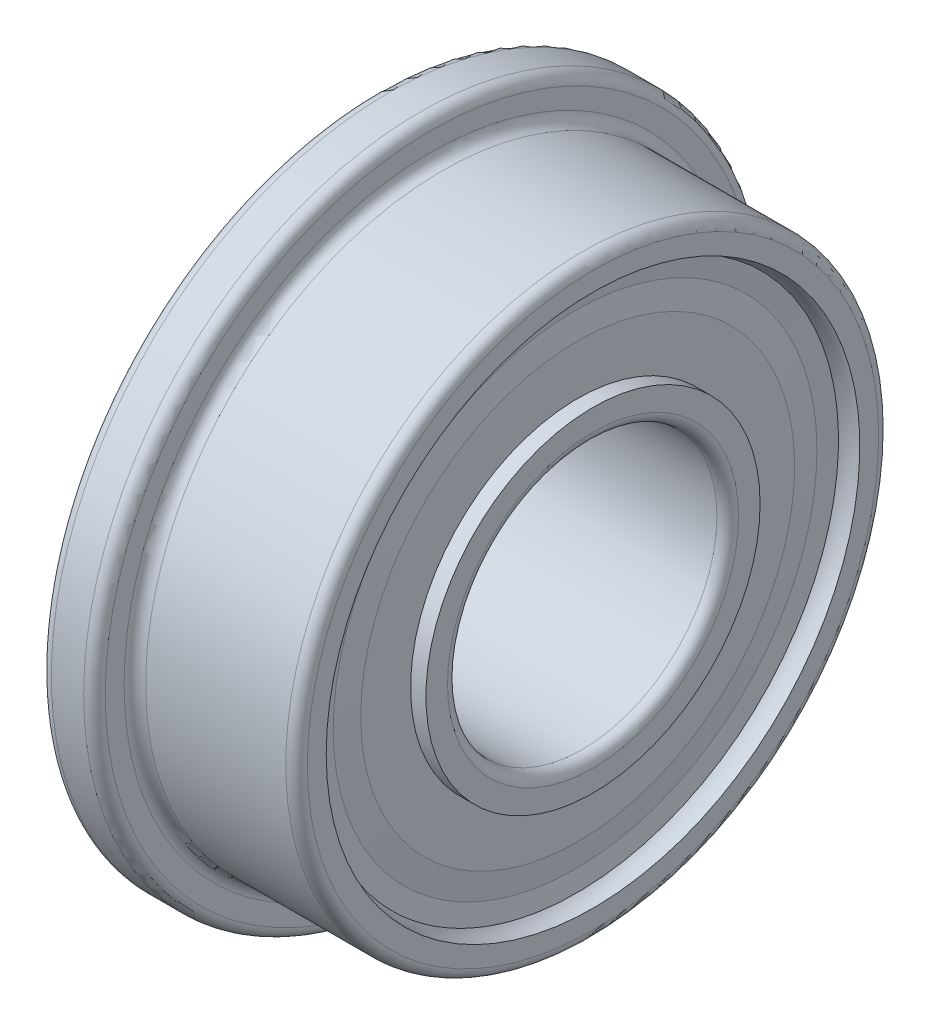
ISO-10303-21;
HEADER;
FILE_DESCRIPTION(('STEP AP214'),'2;1');
FILE_NAME('part.step','',(''),(''),'','','');
FILE_SCHEMA(('AUTOMOTIVE_DESIGN { 1 0 10303 214 1 1 1 1 }'));
ENDSEC;
DATA;
#1=APPLICATION_CONTEXT('core data for automotive mechanical design processes');
#2=APPLICATION_PROTOCOL_DEFINITION('international standard','automotive_design',2000,#1);
#3=PRODUCT_CONTEXT('',#1,'mechanical');
#4=PRODUCT('Part','Part','',(#3));
#5=PRODUCT_RELATED_PRODUCT_CATEGORY('part','',(#4));
#6=PRODUCT_DEFINITION_FORMATION('','',#4);
#7=PRODUCT_DEFINITION_CONTEXT('part definition',#1,'design');
#8=PRODUCT_DEFINITION('design','',#6,#7);
#9=PRODUCT_DEFINITION_SHAPE('','',#8);
#10=(LENGTH_UNIT() NAMED_UNIT(*) SI_UNIT(.MILLI.,.METRE.));
#11=(NAMED_UNIT(*) PLANE_ANGLE_UNIT() SI_UNIT($,.RADIAN.));
#12=(NAMED_UNIT(*) SI_UNIT($,.STERADIAN.) SOLID_ANGLE_UNIT());
#13=UNCERTAINTY_MEASURE_WITH_UNIT(LENGTH_MEASURE(1.E-05),#10,'distance_accuracy_value','');
#14=(GEOMETRIC_REPRESENTATION_CONTEXT(3) GLOBAL_UNCERTAINTY_ASSIGNED_CONTEXT((#13)) GLOBAL_UNIT_ASSIGNED_CONTEXT((#10,
#11,#12)) REPRESENTATION_CONTEXT('',''));
#15=CARTESIAN_POINT('',(0.,0.,0.));
#16=DIRECTION('',(0.,0.,1.));
#17=DIRECTION('',(1.,0.,0.));
#18=AXIS2_PLACEMENT_3D('',#15,#16,#17);
#19=CARTESIAN_POINT('',(2.,3.06417777247591,-2.57115043874616));
#20=DIRECTION('',(1.,0.,0.));
#21=DIRECTION('',(0.,0.766044443118978,-0.642787609686539));
#22=AXIS2_PLACEMENT_3D('',#19,#20,#21);
#23=SPHERICAL_SURFACE('',#22,0.794);
#24=CARTESIAN_POINT('',(2.794,3.06417777247591,-2.57115043874616));
#25=VERTEX_POINT('',#24);
#26=VERTEX_LOOP('',#25);
#27=FACE_BOUND('',#26,.T.);
#28=CARTESIAN_POINT('',(1.206,3.06417777247591,-2.57115043874616));
#29=VERTEX_POINT('',#28);
#30=VERTEX_LOOP('',#29);
#31=FACE_BOUND('',#30,.T.);
#32=ADVANCED_FACE('P0_F15',(#27,#31),#23,.T.);
#33=CLOSED_SHELL('',(#32));
#34=MANIFOLD_SOLID_BREP('P0_B1',#33);
#35=CARTESIAN_POINT('',(2.,-2.,3.46410161513775));
#36=DIRECTION('',(1.,0.,0.));
#37=DIRECTION('',(0.,-0.5,0.866025403784438));
#38=AXIS2_PLACEMENT_3D('',#35,#36,#37);
#39=SPHERICAL_SURFACE('',#38,0.794);
#40=CARTESIAN_POINT('',(2.794,-2.,3.46410161513775));
#41=VERTEX_POINT('',#40);
#42=VERTEX_LOOP('',#41);
#43=FACE_BOUND('',#42,.T.);
#44=CARTESIAN_POINT('',(1.206,-2.,3.46410161513775));
#45=VERTEX_POINT('',#44);
#46=VERTEX_LOOP('',#45);
#47=FACE_BOUND('',#46,.T.);
#48=ADVANCED_FACE('P1_F15',(#43,#47),#39,.T.);
#49=CLOSED_SHELL('',(#48));
#50=MANIFOLD_SOLID_BREP('P1_B1',#49);
#51=CARTESIAN_POINT('',(2.,0.,0.));
#52=DIRECTION('',(-1.,0.,0.));
#53=DIRECTION('',(0.,0.,1.));
#54=AXIS2_PLACEMENT_3D('',#51,#52,#53);
#55=TOROIDAL_SURFACE('',#54,4.,0.794);
#56=CARTESIAN_POINT('',(1.47996538576745,0.,0.));
#57=DIRECTION('',(1.,0.,0.));
#58=DIRECTION('',(0.,0.,-1.));
#59=AXIS2_PLACEMENT_3D('',#56,#57,#58);
#60=CIRCLE('',#59,3.4);
#61=CARTESIAN_POINT('',(1.47996538576745,0.,-3.4));
#62=VERTEX_POINT('',#61);
#63=EDGE_CURVE('P2_E200',#62,#62,#60,.F.);
#64=ORIENTED_EDGE('',*,*,#63,.F.);
#65=EDGE_LOOP('',(#64));
#66=FACE_BOUND('',#65,.T.);
#67=CARTESIAN_POINT('',(2.52003461423255,0.,0.));
#68=DIRECTION('',(1.,0.,0.));
#69=DIRECTION('',(0.,0.,-1.));
#70=AXIS2_PLACEMENT_3D('',#67,#68,#69);
#71=CIRCLE('',#70,3.4);
#72=CARTESIAN_POINT('',(2.52003461423255,0.,-3.4));
#73=VERTEX_POINT('',#72);
#74=EDGE_CURVE('P2_E195',#73,#73,#71,.T.);
#75=ORIENTED_EDGE('',*,*,#74,.F.);
#76=EDGE_LOOP('',(#75));
#77=FACE_BOUND('',#76,.T.);
#78=ADVANCED_FACE('P2_F16',(#66,#77),#55,.F.);
#79=CARTESIAN_POINT('',(0.773482692883724,0.,0.));
#80=DIRECTION('',(1.,0.,0.));
#81=DIRECTION('',(0.,0.,-1.));
#82=AXIS2_PLACEMENT_3D('',#79,#80,#81);
#83=CYLINDRICAL_SURFACE('',#82,3.4);
#84=CARTESIAN_POINT('',(0.647109888428069,0.,0.));
#85=DIRECTION('',(-1.,0.,0.));
#86=DIRECTION('',(0.,0.,1.));
#87=AXIS2_PLACEMENT_3D('',#84,#85,#86);
#88=CIRCLE('',#87,3.4);
#89=CARTESIAN_POINT('',(0.647109888428069,0.,3.4));
#90=VERTEX_POINT('',#89);
#91=EDGE_CURVE('P2_E193',#90,#90,#88,.F.);
#92=ORIENTED_EDGE('',*,*,#91,.T.);
#93=EDGE_LOOP('',(#92));
#94=FACE_BOUND('',#93,.T.);
#95=ORIENTED_EDGE('',*,*,#63,.T.);
#96=EDGE_LOOP('',(#95));
#97=FACE_BOUND('',#96,.T.);
#98=ADVANCED_FACE('P2_F277',(#94,#97),#83,.T.);
#99=CARTESIAN_POINT('',(3.22651730711628,0.,0.));
#100=DIRECTION('',(1.,0.,0.));
#101=DIRECTION('',(0.,0.,-1.));
#102=AXIS2_PLACEMENT_3D('',#99,#100,#101);
#103=CYLINDRICAL_SURFACE('',#102,3.4);
#104=CARTESIAN_POINT('',(3.35289011157193,0.,0.));
#105=DIRECTION('',(-1.,0.,0.));
#106=DIRECTION('',(0.,0.,1.));
#107=AXIS2_PLACEMENT_3D('',#104,#105,#106);
#108=CIRCLE('',#107,3.4);
#109=CARTESIAN_POINT('',(3.35289011157193,0.,3.4));
#110=VERTEX_POINT('',#109);
#111=EDGE_CURVE('P2_E190',#110,#110,#108,.T.);
#112=ORIENTED_EDGE('',*,*,#111,.T.);
#113=EDGE_LOOP('',(#112));
#114=FACE_BOUND('',#113,.T.);
#115=ORIENTED_EDGE('',*,*,#74,.T.);
#116=EDGE_LOOP('',(#115));
#117=FACE_BOUND('',#116,.T.);
#118=ADVANCED_FACE('P2_F270',(#114,#117),#103,.T.);
#119=CARTESIAN_POINT('',(0.324,0.,0.));
#120=DIRECTION('',(-1.,0.,0.));
#121=DIRECTION('',(0.,0.,1.));
#122=AXIS2_PLACEMENT_3D('',#119,#120,#121);
#123=TOROIDAL_SURFACE('',#122,3.424,0.323999999999999);
#124=ORIENTED_EDGE('',*,*,#91,.F.);
#125=EDGE_LOOP('',(#124));
#126=FACE_BOUND('',#125,.T.);
#127=CARTESIAN_POINT('',(0.324,0.,0.));
#128=DIRECTION('',(1.,0.,0.));
#129=DIRECTION('',(0.,0.,-1.));
#130=AXIS2_PLACEMENT_3D('',#127,#128,#129);
#131=CIRCLE('',#130,3.1);
#132=CARTESIAN_POINT('',(0.324,0.,-3.1));
#133=VERTEX_POINT('',#132);
#134=EDGE_CURVE('P2_E185',#133,#133,#131,.F.);
#135=ORIENTED_EDGE('',*,*,#134,.F.);
#136=EDGE_LOOP('',(#135));
#137=FACE_BOUND('',#136,.T.);
#138=ADVANCED_FACE('P2_F176',(#126,#137),#123,.F.);
#139=CARTESIAN_POINT('',(3.676,0.,0.));
#140=DIRECTION('',(-1.,0.,0.));
#141=DIRECTION('',(0.,0.,1.));
#142=AXIS2_PLACEMENT_3D('',#139,#140,#141);
#143=TOROIDAL_SURFACE('',#142,3.424,0.323999999999999);
#144=CARTESIAN_POINT('',(3.676,0.,0.));
#145=DIRECTION('',(1.,0.,0.));
#146=DIRECTION('',(0.,0.,-1.));
#147=AXIS2_PLACEMENT_3D('',#144,#145,#146);
#148=CIRCLE('',#147,3.1);
#149=CARTESIAN_POINT('',(3.676,0.,-3.1));
#150=VERTEX_POINT('',#149);
#151=EDGE_CURVE('P2_E182',#150,#150,#148,.T.);
#152=ORIENTED_EDGE('',*,*,#151,.F.);
#153=EDGE_LOOP('',(#152));
#154=FACE_BOUND('',#153,.T.);
#155=ORIENTED_EDGE('',*,*,#111,.F.);
#156=EDGE_LOOP('',(#155));
#157=FACE_BOUND('',#156,.T.);
#158=ADVANCED_FACE('P2_F172',(#154,#157),#143,.F.);
#159=CARTESIAN_POINT('',(0.162,0.,0.));
#160=DIRECTION('',(1.,0.,0.));
#161=DIRECTION('',(0.,0.,-1.));
#162=AXIS2_PLACEMENT_3D('',#159,#160,#161);
#163=CYLINDRICAL_SURFACE('',#162,3.1);
#164=CARTESIAN_POINT('',(0.,0.,0.));
#165=DIRECTION('',(1.,0.,0.));
#166=DIRECTION('',(0.,0.,-1.));
#167=AXIS2_PLACEMENT_3D('',#164,#165,#166);
#168=CIRCLE('',#167,3.1);
#169=CARTESIAN_POINT('',(0.,0.,-3.1));
#170=VERTEX_POINT('',#169);
#171=EDGE_CURVE('P2_E184',#170,#170,#168,.F.);
#172=ORIENTED_EDGE('',*,*,#171,.F.);
#173=EDGE_LOOP('',(#172));
#174=FACE_BOUND('',#173,.T.);
#175=ORIENTED_EDGE('',*,*,#134,.T.);
#176=EDGE_LOOP('',(#175));
#177=FACE_BOUND('',#176,.T.);
#178=ADVANCED_FACE('P2_F168',(#174,#177),#163,.T.);
#179=CARTESIAN_POINT('',(3.838,0.,0.));
#180=DIRECTION('',(1.,0.,0.));
#181=DIRECTION('',(0.,0.,-1.));
#182=AXIS2_PLACEMENT_3D('',#179,#180,#181);
#183=CYLINDRICAL_SURFACE('',#182,3.1);
#184=CARTESIAN_POINT('',(4.,0.,0.));
#185=DIRECTION('',(1.,0.,0.));
#186=DIRECTION('',(0.,0.,-1.));
#187=AXIS2_PLACEMENT_3D('',#184,#185,#186);
#188=CIRCLE('',#187,3.1);
#189=CARTESIAN_POINT('',(4.,0.,-3.1));
#190=VERTEX_POINT('',#189);
#191=EDGE_CURVE('P2_E64',#190,#190,#188,.T.);
#192=ORIENTED_EDGE('',*,*,#191,.F.);
#193=EDGE_LOOP('',(#192));
#194=FACE_BOUND('',#193,.T.);
#195=ORIENTED_EDGE('',*,*,#151,.T.);
#196=EDGE_LOOP('',(#195));
#197=FACE_BOUND('',#196,.T.);
#198=ADVANCED_FACE('P2_F156',(#194,#197),#183,.T.);
#199=CARTESIAN_POINT('',(0.,3.0165,0.));
#200=DIRECTION('',(-1.,0.,0.));
#201=DIRECTION('',(0.,-1.,0.));
#202=AXIS2_PLACEMENT_3D('',#199,#200,#201);
#203=PLANE('',#202);
#204=CARTESIAN_POINT('',(0.,0.,0.));
#205=DIRECTION('',(-1.,0.,0.));
#206=DIRECTION('',(0.,0.,1.));
#207=AXIS2_PLACEMENT_3D('',#204,#205,#206);
#208=CIRCLE('',#207,2.7);
#209=CARTESIAN_POINT('',(0.,0.,2.7));
#210=VERTEX_POINT('',#209);
#211=CARTESIAN_POINT('',(0.,2.7,0.));
#212=VERTEX_POINT('',#211);
#213=EDGE_CURVE('P2_E52',#210,#212,#208,.T.);
#214=ORIENTED_EDGE('',*,*,#213,.F.);
#215=CARTESIAN_POINT('',(0.,0.,0.));
#216=DIRECTION('',(-1.,0.,0.));
#217=DIRECTION('',(0.,0.,-1.));
#218=AXIS2_PLACEMENT_3D('',#215,#216,#217);
#219=CIRCLE('',#218,2.7);
#220=CARTESIAN_POINT('',(0.,0.,-2.7));
#221=VERTEX_POINT('',#220);
#222=EDGE_CURVE('P2_E60',#221,#210,#219,.T.);
#223=ORIENTED_EDGE('',*,*,#222,.F.);
#224=CARTESIAN_POINT('',(0.,0.,0.));
#225=DIRECTION('',(-1.,0.,0.));
#226=DIRECTION('',(0.,1.,0.));
#227=AXIS2_PLACEMENT_3D('',#224,#225,#226);
#228=CIRCLE('',#227,2.7);
#229=EDGE_CURVE('P2_E62',#212,#221,#228,.T.);
#230=ORIENTED_EDGE('',*,*,#229,.F.);
#231=EDGE_LOOP('',(#214,#223,#230));
#232=FACE_BOUND('',#231,.T.);
#233=ORIENTED_EDGE('',*,*,#171,.T.);
#234=EDGE_LOOP('',(#233));
#235=FACE_BOUND('',#234,.T.);
#236=ADVANCED_FACE('P2_F58',(#232,#235),#203,.T.);
#237=CARTESIAN_POINT('',(4.,3.0165,0.));
#238=DIRECTION('',(1.,0.,0.));
#239=DIRECTION('',(0.,1.,0.));
#240=AXIS2_PLACEMENT_3D('',#237,#238,#239);
#241=PLANE('',#240);
#242=CARTESIAN_POINT('',(4.,0.,0.));
#243=DIRECTION('',(1.,0.,0.));
#244=DIRECTION('',(0.,0.,1.));
#245=AXIS2_PLACEMENT_3D('',#242,#243,#244);
#246=CIRCLE('',#245,2.7);
#247=CARTESIAN_POINT('',(4.,0.,2.7));
#248=VERTEX_POINT('',#247);
#249=CARTESIAN_POINT('',(4.,0.,-2.7));
#250=VERTEX_POINT('',#249);
#251=EDGE_CURVE('P2_E69',#248,#250,#246,.T.);
#252=ORIENTED_EDGE('',*,*,#251,.F.);
#253=CARTESIAN_POINT('',(4.,0.,0.));
#254=DIRECTION('',(1.,0.,0.));
#255=DIRECTION('',(0.,1.,0.));
#256=AXIS2_PLACEMENT_3D('',#253,#254,#255);
#257=CIRCLE('',#256,2.7);
#258=CARTESIAN_POINT('',(4.,2.7,0.));
#259=VERTEX_POINT('',#258);
#260=EDGE_CURVE('P2_E121',#259,#248,#257,.T.);
#261=ORIENTED_EDGE('',*,*,#260,.F.);
#262=CARTESIAN_POINT('',(4.,0.,0.));
#263=DIRECTION('',(1.,0.,0.));
#264=DIRECTION('',(0.,0.,-1.));
#265=AXIS2_PLACEMENT_3D('',#262,#263,#264);
#266=CIRCLE('',#265,2.7);
#267=EDGE_CURVE('P2_E37',#250,#259,#266,.T.);
#268=ORIENTED_EDGE('',*,*,#267,.F.);
#269=EDGE_LOOP('',(#252,#261,#268));
#270=FACE_BOUND('',#269,.T.);
#271=ORIENTED_EDGE('',*,*,#191,.T.);
#272=EDGE_LOOP('',(#271));
#273=FACE_BOUND('',#272,.T.);
#274=ADVANCED_FACE('P2_F90',(#270,#273),#241,.T.);
#275=CARTESIAN_POINT('',(0.2,0.,0.));
#276=DIRECTION('',(-1.,0.,0.));
#277=DIRECTION('',(0.,0.,1.));
#278=AXIS2_PLACEMENT_3D('',#275,#276,#277);
#279=TOROIDAL_SURFACE('',#278,2.7,0.2);
#280=CARTESIAN_POINT('',(0.2,0.,0.));
#281=DIRECTION('',(1.,0.,0.));
#282=DIRECTION('',(0.,0.,-1.));
#283=AXIS2_PLACEMENT_3D('',#280,#281,#282);
#284=CIRCLE('',#283,2.5);
#285=CARTESIAN_POINT('',(0.2,0.,-2.5));
#286=VERTEX_POINT('',#285);
#287=EDGE_CURVE('P2_E28',#286,#286,#284,.T.);
#288=ORIENTED_EDGE('',*,*,#287,.T.);
#289=EDGE_LOOP('',(#288));
#290=FACE_BOUND('',#289,.T.);
#291=ORIENTED_EDGE('',*,*,#222,.T.);
#292=ORIENTED_EDGE('',*,*,#213,.T.);
#293=ORIENTED_EDGE('',*,*,#229,.T.);
#294=EDGE_LOOP('',(#291,#292,#293));
#295=FACE_BOUND('',#294,.T.);
#296=ADVANCED_FACE('P2_F68',(#290,#295),#279,.T.);
#297=CARTESIAN_POINT('',(3.8,0.,0.));
#298=DIRECTION('',(-1.,0.,0.));
#299=DIRECTION('',(0.,0.,1.));
#300=AXIS2_PLACEMENT_3D('',#297,#298,#299);
#301=TOROIDAL_SURFACE('',#300,2.7,0.2);
#302=CARTESIAN_POINT('',(3.8,0.,0.));
#303=DIRECTION('',(1.,0.,0.));
#304=DIRECTION('',(0.,0.,-1.));
#305=AXIS2_PLACEMENT_3D('',#302,#303,#304);
#306=CIRCLE('',#305,2.5);
#307=CARTESIAN_POINT('',(3.8,0.,-2.5));
#308=VERTEX_POINT('',#307);
#309=EDGE_CURVE('P2_E11',#308,#308,#306,.F.);
#310=ORIENTED_EDGE('',*,*,#309,.T.);
#311=EDGE_LOOP('',(#310));
#312=FACE_BOUND('',#311,.T.);
#313=ORIENTED_EDGE('',*,*,#267,.T.);
#314=ORIENTED_EDGE('',*,*,#260,.T.);
#315=ORIENTED_EDGE('',*,*,#251,.T.);
#316=EDGE_LOOP('',(#313,#314,#315));
#317=FACE_BOUND('',#316,.T.);
#318=ADVANCED_FACE('P2_F89',(#312,#317),#301,.T.);
#319=CARTESIAN_POINT('',(2.,0.,0.));
#320=DIRECTION('',(1.,0.,0.));
#321=DIRECTION('',(0.,0.,-1.));
#322=AXIS2_PLACEMENT_3D('',#319,#320,#321);
#323=CYLINDRICAL_SURFACE('',#322,2.5);
#324=ORIENTED_EDGE('',*,*,#309,.F.);
#325=EDGE_LOOP('',(#324));
#326=FACE_BOUND('',#325,.T.);
#327=ORIENTED_EDGE('',*,*,#287,.F.);
#328=EDGE_LOOP('',(#327));
#329=FACE_BOUND('',#328,.T.);
#330=ADVANCED_FACE('P2_F226',(#326,#329),#323,.F.);
#331=CLOSED_SHELL('',(#78,#98,#118,#138,#158,#178,#198,#236,#274,#296,#318,#330));
#332=MANIFOLD_SOLID_BREP('P2_B1',#331);
#333=CARTESIAN_POINT('',(2.,3.06417777247591,2.57115043874616));
#334=DIRECTION('',(1.,0.,0.));
#335=DIRECTION('',(0.,0.766044443118978,0.64278760968654));
#336=AXIS2_PLACEMENT_3D('',#333,#334,#335);
#337=SPHERICAL_SURFACE('',#336,0.794);
#338=CARTESIAN_POINT('',(2.794,3.06417777247591,2.57115043874616));
#339=VERTEX_POINT('',#338);
#340=VERTEX_LOOP('',#339);
#341=FACE_BOUND('',#340,.T.);
#342=CARTESIAN_POINT('',(1.206,3.06417777247591,2.57115043874616));
#343=VERTEX_POINT('',#342);
#344=VERTEX_LOOP('',#343);
#345=FACE_BOUND('',#344,.T.);
#346=ADVANCED_FACE('P3_F15',(#341,#345),#337,.T.);
#347=CLOSED_SHELL('',(#346));
#348=MANIFOLD_SOLID_BREP('P3_B1',#347);
#349=CARTESIAN_POINT('',(2.,-3.75877048314363,1.36808057330267));
#350=DIRECTION('',(1.,0.,0.));
#351=DIRECTION('',(0.,-0.939692620785908,0.342020143325669));
#352=AXIS2_PLACEMENT_3D('',#349,#350,#351);
#353=SPHERICAL_SURFACE('',#352,0.794);
#354=CARTESIAN_POINT('',(2.794,-3.75877048314363,1.36808057330267));
#355=VERTEX_POINT('',#354);
#356=VERTEX_LOOP('',#355);
#357=FACE_BOUND('',#356,.T.);
#358=CARTESIAN_POINT('',(1.206,-3.75877048314363,1.36808057330267));
#359=VERTEX_POINT('',#358);
#360=VERTEX_LOOP('',#359);
#361=FACE_BOUND('',#360,.T.);
#362=ADVANCED_FACE('P4_F15',(#357,#361),#353,.T.);
#363=CLOSED_SHELL('',(#362));
#364=MANIFOLD_SOLID_BREP('P4_B1',#363);
#365=CARTESIAN_POINT('',(2.,0.69459271066772,3.93923101204883));
#366=DIRECTION('',(1.,0.,0.));
#367=DIRECTION('',(0.,0.17364817766693,0.984807753012208));
#368=AXIS2_PLACEMENT_3D('',#365,#366,#367);
#369=SPHERICAL_SURFACE('',#368,0.794);
#370=CARTESIAN_POINT('',(2.794,0.69459271066772,3.93923101204883));
#371=VERTEX_POINT('',#370);
#372=VERTEX_LOOP('',#371);
#373=FACE_BOUND('',#372,.T.);
#374=CARTESIAN_POINT('',(1.206,0.69459271066772,3.93923101204883));
#375=VERTEX_POINT('',#374);
#376=VERTEX_LOOP('',#375);
#377=FACE_BOUND('',#376,.T.);
#378=ADVANCED_FACE('P5_F15',(#373,#377),#369,.T.);
#379=CLOSED_SHELL('',(#378));
#380=MANIFOLD_SOLID_BREP('P5_B1',#379);
#381=CARTESIAN_POINT('',(0.381500000003143,0.,0.));
#382=DIRECTION('',(-1.,0.,0.));
#383=DIRECTION('',(0.,0.,1.));
#384=AXIS2_PLACEMENT_3D('',#381,#382,#383);
#385=CONICAL_SURFACE('',#384,4.950000000008,1.37331599263898);
#386=CARTESIAN_POINT('',(0.3815,0.,0.));
#387=DIRECTION('',(1.,0.,0.));
#388=DIRECTION('',(0.,0.,-1.));
#389=AXIS2_PLACEMENT_3D('',#386,#387,#388);
#390=CIRCLE('',#389,4.95);
#391=CARTESIAN_POINT('',(0.3815,0.,-4.95));
#392=VERTEX_POINT('',#391);
#393=EDGE_CURVE('P6_E29',#392,#392,#390,.F.);
#394=ORIENTED_EDGE('',*,*,#393,.F.);
#395=EDGE_LOOP('',(#394));
#396=FACE_BOUND('',#395,.T.);
#397=CARTESIAN_POINT('',(0.477000000003613,0.,0.));
#398=DIRECTION('',(-1.,0.,0.));
#399=DIRECTION('',(0.,0.,1.));
#400=AXIS2_PLACEMENT_3D('',#397,#398,#399);
#401=CIRCLE('',#400,4.47271040542319);
#402=CARTESIAN_POINT('',(0.477000000003613,0.,4.47271040542319));
#403=VERTEX_POINT('',#402);
#404=EDGE_CURVE('P6_E17',#403,#403,#401,.F.);
#405=ORIENTED_EDGE('',*,*,#404,.F.);
#406=EDGE_LOOP('',(#405));
#407=FACE_BOUND('',#406,.T.);
#408=ADVANCED_FACE('P6_F14',(#396,#407),#385,.T.);
#409=CARTESIAN_POINT('',(0.477,4.2488552027027,0.));
#410=DIRECTION('',(1.,0.,0.));
#411=DIRECTION('',(0.,0.,-1.));
#412=AXIS2_PLACEMENT_3D('',#409,#410,#411);
#413=PLANE('',#412);
#414=CARTESIAN_POINT('',(0.477000000002377,0.,0.));
#415=DIRECTION('',(1.,0.,0.));
#416=DIRECTION('',(0.,0.,-1.));
#417=AXIS2_PLACEMENT_3D('',#414,#415,#416);
#418=CIRCLE('',#417,4.02500000001282);
#419=CARTESIAN_POINT('',(0.477000000002377,0.,-4.02500000001282));
#420=VERTEX_POINT('',#419);
#421=EDGE_CURVE('P6_E31',#420,#420,#418,.F.);
#422=ORIENTED_EDGE('',*,*,#421,.T.);
#423=EDGE_LOOP('',(#422));
#424=FACE_BOUND('',#423,.T.);
#425=ORIENTED_EDGE('',*,*,#404,.T.);
#426=EDGE_LOOP('',(#425));
#427=FACE_BOUND('',#426,.T.);
#428=ADVANCED_FACE('P6_F44',(#424,#427),#413,.T.);
#429=CARTESIAN_POINT('',(0.33375,0.,0.));
#430=DIRECTION('',(1.,0.,0.));
#431=DIRECTION('',(0.,0.,-1.));
#432=AXIS2_PLACEMENT_3D('',#429,#430,#431);
#433=CYLINDRICAL_SURFACE('',#432,4.95);
#434=CARTESIAN_POINT('',(0.286000000002673,0.,0.));
#435=DIRECTION('',(-1.,0.,0.));
#436=DIRECTION('',(0.,1.,0.));
#437=AXIS2_PLACEMENT_3D('',#434,#435,#436);
#438=CIRCLE('',#437,4.950000000008);
#439=CARTESIAN_POINT('',(0.286000000002673,4.950000000008,0.));
#440=VERTEX_POINT('',#439);
#441=EDGE_CURVE('P6_E33',#440,#440,#438,.F.);
#442=ORIENTED_EDGE('',*,*,#441,.T.);
#443=EDGE_LOOP('',(#442));
#444=FACE_BOUND('',#443,.T.);
#445=ORIENTED_EDGE('',*,*,#393,.T.);
#446=EDGE_LOOP('',(#445));
#447=FACE_BOUND('',#446,.T.);
#448=ADVANCED_FACE('P6_F52',(#444,#447),#433,.T.);
#449=CARTESIAN_POINT('',(0.476999999996508,0.,0.));
#450=DIRECTION('',(1.,0.,0.));
#451=DIRECTION('',(0.,0.,-1.));
#452=AXIS2_PLACEMENT_3D('',#449,#450,#451);
#453=CONICAL_SURFACE('',#452,4.02499999995598,1.4679175842122);
#454=ORIENTED_EDGE('',*,*,#421,.F.);
#455=EDGE_LOOP('',(#454));
#456=FACE_BOUND('',#455,.T.);
#457=CARTESIAN_POINT('',(0.3815,0.,0.));
#458=DIRECTION('',(1.,0.,0.));
#459=DIRECTION('',(0.,0.,-1.));
#460=AXIS2_PLACEMENT_3D('',#457,#458,#459);
#461=CIRCLE('',#460,3.1);
#462=CARTESIAN_POINT('',(0.3815,0.,-3.1));
#463=VERTEX_POINT('',#462);
#464=EDGE_CURVE('P6_E37',#463,#463,#461,.F.);
#465=ORIENTED_EDGE('',*,*,#464,.T.);
#466=EDGE_LOOP('',(#465));
#467=FACE_BOUND('',#466,.T.);
#468=ADVANCED_FACE('P6_F71',(#456,#467),#453,.F.);
#469=CARTESIAN_POINT('',(0.286000000009778,0.,0.));
#470=DIRECTION('',(-1.,0.,0.));
#471=DIRECTION('',(0.,0.,1.));
#472=AXIS2_PLACEMENT_3D('',#469,#470,#471);
#473=CONICAL_SURFACE('',#472,4.94999999995116,1.46791758421715);
#474=CARTESIAN_POINT('',(0.333749999995803,0.,0.));
#475=DIRECTION('',(1.,0.,0.));
#476=DIRECTION('',(0.,1.,0.));
#477=AXIS2_PLACEMENT_3D('',#474,#475,#476);
#478=CIRCLE('',#477,4.48749999998199);
#479=CARTESIAN_POINT('',(0.333749999995803,4.48749999998199,0.));
#480=VERTEX_POINT('',#479);
#481=EDGE_CURVE('P6_E26',#480,#480,#478,.F.);
#482=ORIENTED_EDGE('',*,*,#481,.F.);
#483=EDGE_LOOP('',(#482));
#484=FACE_BOUND('',#483,.T.);
#485=ORIENTED_EDGE('',*,*,#441,.F.);
#486=EDGE_LOOP('',(#485));
#487=FACE_BOUND('',#486,.T.);
#488=ADVANCED_FACE('P6_F67',(#484,#487),#473,.F.);
#489=CARTESIAN_POINT('',(0.33375,0.,0.));
#490=DIRECTION('',(1.,0.,0.));
#491=DIRECTION('',(0.,0.,-1.));
#492=AXIS2_PLACEMENT_3D('',#489,#490,#491);
#493=CYLINDRICAL_SURFACE('',#492,3.1);
#494=ORIENTED_EDGE('',*,*,#464,.F.);
#495=EDGE_LOOP('',(#494));
#496=FACE_BOUND('',#495,.T.);
#497=CARTESIAN_POINT('',(0.286,0.,0.));
#498=DIRECTION('',(1.,0.,0.));
#499=DIRECTION('',(0.,0.,-1.));
#500=AXIS2_PLACEMENT_3D('',#497,#498,#499);
#501=CIRCLE('',#500,3.1);
#502=CARTESIAN_POINT('',(0.286,0.,-3.1));
#503=VERTEX_POINT('',#502);
#504=EDGE_CURVE('P6_E21',#503,#503,#501,.T.);
#505=ORIENTED_EDGE('',*,*,#504,.F.);
#506=EDGE_LOOP('',(#505));
#507=FACE_BOUND('',#506,.T.);
#508=ADVANCED_FACE('P6_F60',(#496,#507),#493,.F.);
#509=CARTESIAN_POINT('',(0.333749999988697,0.,0.));
#510=DIRECTION('',(1.,0.,0.));
#511=DIRECTION('',(0.,0.,-1.));
#512=AXIS2_PLACEMENT_3D('',#509,#510,#511);
#513=CONICAL_SURFACE('',#512,4.48749999992515,1.4679175842046);
#514=CARTESIAN_POINT('',(0.285999999994331,0.,0.));
#515=DIRECTION('',(1.,0.,0.));
#516=DIRECTION('',(0.,0.,-1.));
#517=AXIS2_PLACEMENT_3D('',#514,#515,#516);
#518=CIRCLE('',#517,4.02500000001282);
#519=CARTESIAN_POINT('',(0.285999999994331,0.,-4.02500000001282));
#520=VERTEX_POINT('',#519);
#521=EDGE_CURVE('P6_E10',#520,#520,#518,.F.);
#522=ORIENTED_EDGE('',*,*,#521,.F.);
#523=EDGE_LOOP('',(#522));
#524=FACE_BOUND('',#523,.T.);
#525=ORIENTED_EDGE('',*,*,#481,.T.);
#526=EDGE_LOOP('',(#525));
#527=FACE_BOUND('',#526,.T.);
#528=ADVANCED_FACE('P6_F55',(#524,#527),#513,.T.);
#529=CARTESIAN_POINT('',(0.286,3.5625,0.));
#530=DIRECTION('',(-1.,0.,0.));
#531=DIRECTION('',(0.,0.,1.));
#532=AXIS2_PLACEMENT_3D('',#529,#530,#531);
#533=PLANE('',#532);
#534=ORIENTED_EDGE('',*,*,#521,.T.);
#535=EDGE_LOOP('',(#534));
#536=FACE_BOUND('',#535,.T.);
#537=ORIENTED_EDGE('',*,*,#504,.T.);
#538=EDGE_LOOP('',(#537));
#539=FACE_BOUND('',#538,.T.);
#540=ADVANCED_FACE('P6_F53',(#536,#539),#533,.T.);
#541=CLOSED_SHELL('',(#408,#428,#448,#468,#488,#508,#528,#540));
#542=MANIFOLD_SOLID_BREP('P6_B1',#541);
#543=CARTESIAN_POINT('',(2.,-3.75877048314363,-1.36808057330268));
#544=DIRECTION('',(1.,0.,0.));
#545=DIRECTION('',(0.,-0.939692620785908,-0.342020143325669));
#546=AXIS2_PLACEMENT_3D('',#543,#544,#545);
#547=SPHERICAL_SURFACE('',#546,0.794);
#548=CARTESIAN_POINT('',(2.794,-3.75877048314363,-1.36808057330268));
#549=VERTEX_POINT('',#548);
#550=VERTEX_LOOP('',#549);
#551=FACE_BOUND('',#550,.T.);
#552=CARTESIAN_POINT('',(1.206,-3.75877048314363,-1.36808057330268));
#553=VERTEX_POINT('',#552);
#554=VERTEX_LOOP('',#553);
#555=FACE_BOUND('',#554,.T.);
#556=ADVANCED_FACE('P7_F15',(#551,#555),#547,.T.);
#557=CLOSED_SHELL('',(#556));
#558=MANIFOLD_SOLID_BREP('P7_B1',#557);
#559=CARTESIAN_POINT('',(2.,0.694592710667722,-3.93923101204883));
#560=DIRECTION('',(1.,0.,0.));
#561=DIRECTION('',(0.,0.17364817766693,-0.984807753012208));
#562=AXIS2_PLACEMENT_3D('',#559,#560,#561);
#563=SPHERICAL_SURFACE('',#562,0.794);
#564=CARTESIAN_POINT('',(2.794,0.694592710667722,-3.93923101204883));
#565=VERTEX_POINT('',#564);
#566=VERTEX_LOOP('',#565);
#567=FACE_BOUND('',#566,.T.);
#568=CARTESIAN_POINT('',(1.206,0.694592710667722,-3.93923101204883));
#569=VERTEX_POINT('',#568);
#570=VERTEX_LOOP('',#569);
#571=FACE_BOUND('',#570,.T.);
#572=ADVANCED_FACE('P8_F15',(#567,#571),#563,.T.);
#573=CLOSED_SHELL('',(#572));
#574=MANIFOLD_SOLID_BREP('P8_B1',#573);
#575=CARTESIAN_POINT('',(3.61949999999922,0.,0.));
#576=DIRECTION('',(1.,0.,0.));
#577=DIRECTION('',(0.,0.,-1.));
#578=AXIS2_PLACEMENT_3D('',#575,#576,#577);
#579=CONICAL_SURFACE('',#578,4.94999999995116,1.37331599264469);
#580=CARTESIAN_POINT('',(3.52400000001296,0.,0.));
#581=DIRECTION('',(1.,0.,0.));
#582=DIRECTION('',(0.,0.,-1.));
#583=AXIS2_PLACEMENT_3D('',#580,#581,#582);
#584=CIRCLE('',#583,4.47271040542319);
#585=CARTESIAN_POINT('',(3.52400000001296,0.,-4.47271040542319));
#586=VERTEX_POINT('',#585);
#587=EDGE_CURVE('P9_E17',#586,#586,#584,.F.);
#588=ORIENTED_EDGE('',*,*,#587,.F.);
#589=EDGE_LOOP('',(#588));
#590=FACE_BOUND('',#589,.T.);
#591=CARTESIAN_POINT('',(3.6195,0.,0.));
#592=DIRECTION('',(1.,0.,0.));
#593=DIRECTION('',(0.,0.,-1.));
#594=AXIS2_PLACEMENT_3D('',#591,#592,#593);
#595=CIRCLE('',#594,4.95);
#596=CARTESIAN_POINT('',(3.6195,0.,-4.95));
#597=VERTEX_POINT('',#596);
#598=EDGE_CURVE('P9_E29',#597,#597,#595,.T.);
#599=ORIENTED_EDGE('',*,*,#598,.F.);
#600=EDGE_LOOP('',(#599));
#601=FACE_BOUND('',#600,.T.);
#602=ADVANCED_FACE('P9_F14',(#590,#601),#579,.T.);
#603=CARTESIAN_POINT('',(3.66725,0.,0.));
#604=DIRECTION('',(1.,0.,0.));
#605=DIRECTION('',(0.,0.,-1.));
#606=AXIS2_PLACEMENT_3D('',#603,#604,#605);
#607=CYLINDRICAL_SURFACE('',#606,4.95);
#608=ORIENTED_EDGE('',*,*,#598,.T.);
#609=EDGE_LOOP('',(#608));
#610=FACE_BOUND('',#609,.T.);
#611=CARTESIAN_POINT('',(3.71499999999969,0.,0.));
#612=DIRECTION('',(1.,0.,0.));
#613=DIRECTION('',(0.,1.,0.));
#614=AXIS2_PLACEMENT_3D('',#611,#612,#613);
#615=CIRCLE('',#614,4.950000000008);
#616=CARTESIAN_POINT('',(3.71499999999969,4.950000000008,0.));
#617=VERTEX_POINT('',#616);
#618=EDGE_CURVE('P9_E34',#617,#617,#615,.F.);
#619=ORIENTED_EDGE('',*,*,#618,.T.);
#620=EDGE_LOOP('',(#619));
#621=FACE_BOUND('',#620,.T.);
#622=ADVANCED_FACE('P9_F73',(#610,#621),#607,.T.);
#623=CARTESIAN_POINT('',(3.524,4.2488552027027,0.));
#624=DIRECTION('',(-1.,0.,0.));
#625=DIRECTION('',(0.,0.,1.));
#626=AXIS2_PLACEMENT_3D('',#623,#624,#625);
#627=PLANE('',#626);
#628=ORIENTED_EDGE('',*,*,#587,.T.);
#629=EDGE_LOOP('',(#628));
#630=FACE_BOUND('',#629,.T.);
#631=CARTESIAN_POINT('',(3.52399999999288,0.,0.));
#632=DIRECTION('',(-1.,0.,0.));
#633=DIRECTION('',(0.,0.,1.));
#634=AXIS2_PLACEMENT_3D('',#631,#632,#633);
#635=CIRCLE('',#634,4.02500000001282);
#636=CARTESIAN_POINT('',(3.52399999999288,0.,4.02500000001282));
#637=VERTEX_POINT('',#636);
#638=EDGE_CURVE('P9_E31',#637,#637,#635,.F.);
#639=ORIENTED_EDGE('',*,*,#638,.T.);
#640=EDGE_LOOP('',(#639));
#641=FACE_BOUND('',#640,.T.);
#642=ADVANCED_FACE('P9_F70',(#630,#641),#627,.T.);
#643=CARTESIAN_POINT('',(3.71499999999969,0.,0.));
#644=DIRECTION('',(1.,0.,0.));
#645=DIRECTION('',(0.,0.,-1.));
#646=AXIS2_PLACEMENT_3D('',#643,#644,#645);
#647=CONICAL_SURFACE('',#646,4.94999999995116,1.46791758420195);
#648=ORIENTED_EDGE('',*,*,#618,.F.);
#649=EDGE_LOOP('',(#648));
#650=FACE_BOUND('',#649,.T.);
#651=CARTESIAN_POINT('',(3.66725000000656,0.,0.));
#652=DIRECTION('',(-1.,0.,0.));
#653=DIRECTION('',(0.,1.,0.));
#654=AXIS2_PLACEMENT_3D('',#651,#652,#653);
#655=CIRCLE('',#654,4.48749999998199);
#656=CARTESIAN_POINT('',(3.66725000000656,4.48749999998199,0.));
#657=VERTEX_POINT('',#656);
#658=EDGE_CURVE('P9_E33',#657,#657,#655,.F.);
#659=ORIENTED_EDGE('',*,*,#658,.F.);
#660=EDGE_LOOP('',(#659));
#661=FACE_BOUND('',#660,.T.);
#662=ADVANCED_FACE('P9_F67',(#650,#661),#647,.F.);
#663=CARTESIAN_POINT('',(3.52399999999875,0.,0.));
#664=DIRECTION('',(-1.,0.,0.));
#665=DIRECTION('',(0.,0.,1.));
#666=AXIS2_PLACEMENT_3D('',#663,#664,#665);
#667=CONICAL_SURFACE('',#666,4.02499999995598,1.4679175842122);
#668=CARTESIAN_POINT('',(3.6195,0.,0.));
#669=DIRECTION('',(1.,0.,0.));
#670=DIRECTION('',(0.,0.,-1.));
#671=AXIS2_PLACEMENT_3D('',#668,#669,#670);
#672=CIRCLE('',#671,3.1);
#673=CARTESIAN_POINT('',(3.6195,0.,-3.1));
#674=VERTEX_POINT('',#673);
#675=EDGE_CURVE('P9_E26',#674,#674,#672,.T.);
#676=ORIENTED_EDGE('',*,*,#675,.T.);
#677=EDGE_LOOP('',(#676));
#678=FACE_BOUND('',#677,.T.);
#679=ORIENTED_EDGE('',*,*,#638,.F.);
#680=EDGE_LOOP('',(#679));
#681=FACE_BOUND('',#680,.T.);
#682=ADVANCED_FACE('P9_F47',(#678,#681),#667,.F.);
#683=CARTESIAN_POINT('',(3.66725000001367,0.,0.));
#684=DIRECTION('',(-1.,0.,0.));
#685=DIRECTION('',(0.,0.,1.));
#686=AXIS2_PLACEMENT_3D('',#683,#684,#685);
#687=CONICAL_SURFACE('',#686,4.48749999992515,1.4679175842046);
#688=ORIENTED_EDGE('',*,*,#658,.T.);
#689=EDGE_LOOP('',(#688));
#690=FACE_BOUND('',#689,.T.);
#691=CARTESIAN_POINT('',(3.71500000000803,0.,0.));
#692=DIRECTION('',(-1.,0.,0.));
#693=DIRECTION('',(0.,0.,1.));
#694=AXIS2_PLACEMENT_3D('',#691,#692,#693);
#695=CIRCLE('',#694,4.02500000001282);
#696=CARTESIAN_POINT('',(3.71500000000803,0.,4.02500000001282));
#697=VERTEX_POINT('',#696);
#698=EDGE_CURVE('P9_E21',#697,#697,#695,.F.);
#699=ORIENTED_EDGE('',*,*,#698,.F.);
#700=EDGE_LOOP('',(#699));
#701=FACE_BOUND('',#700,.T.);
#702=ADVANCED_FACE('P9_F53',(#690,#701),#687,.T.);
#703=CARTESIAN_POINT('',(3.66725,0.,0.));
#704=DIRECTION('',(1.,0.,0.));
#705=DIRECTION('',(0.,0.,-1.));
#706=AXIS2_PLACEMENT_3D('',#703,#704,#705);
#707=CYLINDRICAL_SURFACE('',#706,3.1);
#708=CARTESIAN_POINT('',(3.715,0.,0.));
#709=DIRECTION('',(1.,0.,0.));
#710=DIRECTION('',(0.,0.,-1.));
#711=AXIS2_PLACEMENT_3D('',#708,#709,#710);
#712=CIRCLE('',#711,3.1);
#713=CARTESIAN_POINT('',(3.715,0.,-3.1));
#714=VERTEX_POINT('',#713);
#715=EDGE_CURVE('P9_E10',#714,#714,#712,.F.);
#716=ORIENTED_EDGE('',*,*,#715,.F.);
#717=EDGE_LOOP('',(#716));
#718=FACE_BOUND('',#717,.T.);
#719=ORIENTED_EDGE('',*,*,#675,.F.);
#720=EDGE_LOOP('',(#719));
#721=FACE_BOUND('',#720,.T.);
#722=ADVANCED_FACE('P9_F50',(#718,#721),#707,.F.);
#723=CARTESIAN_POINT('',(3.715,3.5625,0.));
#724=DIRECTION('',(1.,0.,0.));
#725=DIRECTION('',(0.,0.,-1.));
#726=AXIS2_PLACEMENT_3D('',#723,#724,#725);
#727=PLANE('',#726);
#728=ORIENTED_EDGE('',*,*,#715,.T.);
#729=EDGE_LOOP('',(#728));
#730=FACE_BOUND('',#729,.T.);
#731=ORIENTED_EDGE('',*,*,#698,.T.);
#732=EDGE_LOOP('',(#731));
#733=FACE_BOUND('',#732,.T.);
#734=ADVANCED_FACE('P9_F52',(#730,#733),#727,.T.);
#735=CLOSED_SHELL('',(#602,#622,#642,#662,#682,#702,#722,#734));
#736=MANIFOLD_SOLID_BREP('P9_B1',#735);
#737=CARTESIAN_POINT('',(0.839982692883723,0.,0.));
#738=DIRECTION('',(1.,0.,0.));
#739=DIRECTION('',(0.,0.,-1.));
#740=AXIS2_PLACEMENT_3D('',#737,#738,#739);
#741=CYLINDRICAL_SURFACE('',#740,4.6);
#742=CARTESIAN_POINT('',(0.463874983158178,0.,0.));
#743=DIRECTION('',(-1.,0.,0.));
#744=DIRECTION('',(0.,0.,1.));
#745=AXIS2_PLACEMENT_3D('',#742,#743,#744);
#746=CIRCLE('',#745,4.6);
#747=CARTESIAN_POINT('',(0.463874983158178,0.,4.6));
#748=VERTEX_POINT('',#747);
#749=EDGE_CURVE('P10_E150',#748,#748,#746,.T.);
#750=ORIENTED_EDGE('',*,*,#749,.T.);
#751=EDGE_LOOP('',(#750));
#752=FACE_BOUND('',#751,.T.);
#753=CARTESIAN_POINT('',(1.47996538576745,0.,0.));
#754=DIRECTION('',(-1.,0.,0.));
#755=DIRECTION('',(0.,0.,1.));
#756=AXIS2_PLACEMENT_3D('',#753,#754,#755);
#757=CIRCLE('',#756,4.6);
#758=CARTESIAN_POINT('',(1.47996538576745,0.,4.6));
#759=VERTEX_POINT('',#758);
#760=EDGE_CURVE('P10_E147',#759,#759,#757,.F.);
#761=ORIENTED_EDGE('',*,*,#760,.T.);
#762=EDGE_LOOP('',(#761));
#763=FACE_BOUND('',#762,.T.);
#764=ADVANCED_FACE('P10_F16',(#752,#763),#741,.F.);
#765=CARTESIAN_POINT('',(0.,0.,0.));
#766=DIRECTION('',(-1.,0.,0.));
#767=DIRECTION('',(0.,0.,1.));
#768=AXIS2_PLACEMENT_3D('',#765,#766,#767);
#769=TOROIDAL_SURFACE('',#768,4.4676,0.4824);
#770=CARTESIAN_POINT('',(0.,0.,0.));
#771=DIRECTION('',(-1.,0.,0.));
#772=DIRECTION('',(0.,0.,1.));
#773=AXIS2_PLACEMENT_3D('',#770,#771,#772);
#774=CIRCLE('',#773,4.95);
#775=CARTESIAN_POINT('',(0.,0.,4.95));
#776=VERTEX_POINT('',#775);
#777=EDGE_CURVE('P10_E79',#776,#776,#774,.F.);
#778=ORIENTED_EDGE('',*,*,#777,.F.);
#779=EDGE_LOOP('',(#778));
#780=FACE_BOUND('',#779,.T.);
#781=ORIENTED_EDGE('',*,*,#749,.F.);
#782=EDGE_LOOP('',(#781));
#783=FACE_BOUND('',#782,.T.);
#784=ADVANCED_FACE('P10_F130',(#780,#783),#769,.F.);
#785=CARTESIAN_POINT('',(0.,5.425,0.));
#786=DIRECTION('',(-1.,0.,0.));
#787=DIRECTION('',(0.,0.,1.));
#788=AXIS2_PLACEMENT_3D('',#785,#786,#787);
#789=PLANE('',#788);
#790=CARTESIAN_POINT('',(0.,0.,0.));
#791=DIRECTION('',(1.,0.,0.));
#792=DIRECTION('',(0.,0.,1.));
#793=AXIS2_PLACEMENT_3D('',#790,#791,#792);
#794=CIRCLE('',#793,6.05);
#795=CARTESIAN_POINT('',(0.,0.,6.05));
#796=VERTEX_POINT('',#795);
#797=CARTESIAN_POINT('',(0.,0.,-6.05));
#798=VERTEX_POINT('',#797);
#799=EDGE_CURVE('P10_E69',#796,#798,#794,.T.);
#800=ORIENTED_EDGE('',*,*,#799,.F.);
#801=CARTESIAN_POINT('',(0.,0.,0.));
#802=DIRECTION('',(1.,0.,0.));
#803=DIRECTION('',(0.,1.,0.));
#804=AXIS2_PLACEMENT_3D('',#801,#802,#803);
#805=CIRCLE('',#804,6.05);
#806=CARTESIAN_POINT('',(0.,6.05,0.));
#807=VERTEX_POINT('',#806);
#808=EDGE_CURVE('P10_E75',#807,#796,#805,.T.);
#809=ORIENTED_EDGE('',*,*,#808,.F.);
#810=CARTESIAN_POINT('',(0.,0.,0.));
#811=DIRECTION('',(1.,0.,0.));
#812=DIRECTION('',(0.,0.,-1.));
#813=AXIS2_PLACEMENT_3D('',#810,#811,#812);
#814=CIRCLE('',#813,6.05);
#815=EDGE_CURVE('P10_E77',#798,#807,#814,.T.);
#816=ORIENTED_EDGE('',*,*,#815,.F.);
#817=EDGE_LOOP('',(#800,#809,#816));
#818=FACE_BOUND('',#817,.T.);
#819=ORIENTED_EDGE('',*,*,#777,.T.);
#820=EDGE_LOOP('',(#819));
#821=FACE_BOUND('',#820,.T.);
#822=ADVANCED_FACE('P10_F73',(#818,#821),#789,.T.);
#823=CARTESIAN_POINT('',(2.,0.,0.));
#824=DIRECTION('',(-1.,0.,0.));
#825=DIRECTION('',(0.,0.,1.));
#826=AXIS2_PLACEMENT_3D('',#823,#824,#825);
#827=TOROIDAL_SURFACE('',#826,4.,0.793999999999999);
#828=ORIENTED_EDGE('',*,*,#760,.F.);
#829=EDGE_LOOP('',(#828));
#830=FACE_BOUND('',#829,.T.);
#831=CARTESIAN_POINT('',(2.52003461423255,0.,0.));
#832=DIRECTION('',(1.,0.,0.));
#833=DIRECTION('',(0.,0.,-1.));
#834=AXIS2_PLACEMENT_3D('',#831,#832,#833);
#835=CIRCLE('',#834,4.6);
#836=CARTESIAN_POINT('',(2.52003461423255,0.,-4.6));
#837=VERTEX_POINT('',#836);
#838=EDGE_CURVE('P10_E85',#837,#837,#835,.T.);
#839=ORIENTED_EDGE('',*,*,#838,.T.);
#840=EDGE_LOOP('',(#839));
#841=FACE_BOUND('',#840,.T.);
#842=ADVANCED_FACE('P10_F105',(#830,#841),#827,.F.);
#843=CARTESIAN_POINT('',(0.200000000000001,0.,0.));
#844=DIRECTION('',(-1.,0.,0.));
#845=DIRECTION('',(0.,0.,1.));
#846=AXIS2_PLACEMENT_3D('',#843,#844,#845);
#847=TOROIDAL_SURFACE('',#846,6.05,0.200000000000001);
#848=CARTESIAN_POINT('',(0.2,0.,0.));
#849=DIRECTION('',(1.,0.,0.));
#850=DIRECTION('',(0.,0.,-1.));
#851=AXIS2_PLACEMENT_3D('',#848,#849,#850);
#852=CIRCLE('',#851,6.25);
#853=CARTESIAN_POINT('',(0.2,0.,-6.25));
#854=VERTEX_POINT('',#853);
#855=EDGE_CURVE('P10_E116',#854,#854,#852,.T.);
#856=ORIENTED_EDGE('',*,*,#855,.F.);
#857=EDGE_LOOP('',(#856));
#858=FACE_BOUND('',#857,.T.);
#859=ORIENTED_EDGE('',*,*,#815,.T.);
#860=ORIENTED_EDGE('',*,*,#808,.T.);
#861=ORIENTED_EDGE('',*,*,#799,.T.);
#862=EDGE_LOOP('',(#859,#860,#861));
#863=FACE_BOUND('',#862,.T.);
#864=ADVANCED_FACE('P10_F83',(#858,#863),#847,.T.);
#865=CARTESIAN_POINT('',(3.16001730711628,0.,0.));
#866=DIRECTION('',(1.,0.,0.));
#867=DIRECTION('',(0.,0.,-1.));
#868=AXIS2_PLACEMENT_3D('',#865,#866,#867);
#869=CYLINDRICAL_SURFACE('',#868,4.6);
#870=CARTESIAN_POINT('',(3.53612501684182,0.,0.));
#871=DIRECTION('',(-1.,0.,0.));
#872=DIRECTION('',(0.,0.,1.));
#873=AXIS2_PLACEMENT_3D('',#870,#871,#872);
#874=CIRCLE('',#873,4.6);
#875=CARTESIAN_POINT('',(3.53612501684182,0.,4.6));
#876=VERTEX_POINT('',#875);
#877=EDGE_CURVE('P10_E114',#876,#876,#874,.F.);
#878=ORIENTED_EDGE('',*,*,#877,.T.);
#879=EDGE_LOOP('',(#878));
#880=FACE_BOUND('',#879,.T.);
#881=ORIENTED_EDGE('',*,*,#838,.F.);
#882=EDGE_LOOP('',(#881));
#883=FACE_BOUND('',#882,.T.);
#884=ADVANCED_FACE('P10_F104',(#880,#883),#869,.F.);
#885=CARTESIAN_POINT('',(0.5,0.,0.));
#886=DIRECTION('',(1.,0.,0.));
#887=DIRECTION('',(0.,0.,-1.));
#888=AXIS2_PLACEMENT_3D('',#885,#886,#887);
#889=CYLINDRICAL_SURFACE('',#888,6.25);
#890=CARTESIAN_POINT('',(0.799999999999999,0.,0.));
#891=DIRECTION('',(-1.,0.,0.));
#892=DIRECTION('',(0.,0.,1.));
#893=AXIS2_PLACEMENT_3D('',#890,#891,#892);
#894=CIRCLE('',#893,6.25);
#895=CARTESIAN_POINT('',(0.799999999999999,0.,6.25));
#896=VERTEX_POINT('',#895);
#897=EDGE_CURVE('P10_E157',#896,#896,#894,.F.);
#898=ORIENTED_EDGE('',*,*,#897,.F.);
#899=EDGE_LOOP('',(#898));
#900=FACE_BOUND('',#899,.T.);
#901=ORIENTED_EDGE('',*,*,#855,.T.);
#902=EDGE_LOOP('',(#901));
#903=FACE_BOUND('',#902,.T.);
#904=ADVANCED_FACE('P10_F419',(#900,#903),#889,.T.);
#905=CARTESIAN_POINT('',(4.,0.,0.));
#906=DIRECTION('',(-1.,0.,0.));
#907=DIRECTION('',(0.,0.,1.));
#908=AXIS2_PLACEMENT_3D('',#905,#906,#907);
#909=TOROIDAL_SURFACE('',#908,4.4676,0.482400000000001);
#910=ORIENTED_EDGE('',*,*,#877,.F.);
#911=EDGE_LOOP('',(#910));
#912=FACE_BOUND('',#911,.T.);
#913=CARTESIAN_POINT('',(4.,0.,0.));
#914=DIRECTION('',(-1.,0.,0.));
#915=DIRECTION('',(0.,0.,1.));
#916=AXIS2_PLACEMENT_3D('',#913,#914,#915);
#917=CIRCLE('',#916,4.95);
#918=CARTESIAN_POINT('',(4.,0.,4.95));
#919=VERTEX_POINT('',#918);
#920=EDGE_CURVE('P10_E153',#919,#919,#917,.T.);
#921=ORIENTED_EDGE('',*,*,#920,.F.);
#922=EDGE_LOOP('',(#921));
#923=FACE_BOUND('',#922,.T.);
#924=ADVANCED_FACE('P10_F316',(#912,#923),#909,.F.);
#925=CARTESIAN_POINT('',(0.799999999999999,0.,0.));
#926=DIRECTION('',(-1.,0.,0.));
#927=DIRECTION('',(0.,0.,1.));
#928=AXIS2_PLACEMENT_3D('',#925,#926,#927);
#929=TOROIDAL_SURFACE('',#928,6.05,0.200000000000001);
#930=ORIENTED_EDGE('',*,*,#897,.T.);
#931=EDGE_LOOP('',(#930));
#932=FACE_BOUND('',#931,.T.);
#933=CARTESIAN_POINT('',(1.,0.,0.));
#934=DIRECTION('',(-1.,0.,0.));
#935=DIRECTION('',(0.,0.,-1.));
#936=AXIS2_PLACEMENT_3D('',#933,#934,#935);
#937=CIRCLE('',#936,6.05);
#938=CARTESIAN_POINT('',(0.999999999999999,0.,6.05));
#939=VERTEX_POINT('',#938);
#940=CARTESIAN_POINT('',(0.999999999999999,0.,-6.05));
#941=VERTEX_POINT('',#940);
#942=EDGE_CURVE('P10_E343',#939,#941,#937,.F.);
#943=ORIENTED_EDGE('',*,*,#942,.F.);
#944=CARTESIAN_POINT('',(1.,0.,0.));
#945=DIRECTION('',(-1.,0.,0.));
#946=DIRECTION('',(0.,0.,1.));
#947=AXIS2_PLACEMENT_3D('',#944,#945,#946);
#948=CIRCLE('',#947,6.05);
#949=CARTESIAN_POINT('',(1.,6.05,0.));
#950=VERTEX_POINT('',#949);
#951=EDGE_CURVE('P10_E344',#950,#939,#948,.F.);
#952=ORIENTED_EDGE('',*,*,#951,.F.);
#953=CARTESIAN_POINT('',(1.,0.,0.));
#954=DIRECTION('',(-1.,0.,0.));
#955=DIRECTION('',(0.,1.,0.));
#956=AXIS2_PLACEMENT_3D('',#953,#954,#955);
#957=CIRCLE('',#956,6.05);
#958=EDGE_CURVE('P10_E156',#941,#950,#957,.F.);
#959=ORIENTED_EDGE('',*,*,#958,.F.);
#960=EDGE_LOOP('',(#943,#952,#959));
#961=FACE_BOUND('',#960,.T.);
#962=ADVANCED_FACE('P10_F312',(#932,#961),#929,.T.);
#963=CARTESIAN_POINT('',(4.,5.05,0.));
#964=DIRECTION('',(1.,0.,0.));
#965=DIRECTION('',(0.,0.,-1.));
#966=AXIS2_PLACEMENT_3D('',#963,#964,#965);
#967=PLANE('',#966);
#968=CARTESIAN_POINT('',(4.,0.,0.));
#969=DIRECTION('',(-1.,0.,0.));
#970=DIRECTION('',(0.,0.,1.));
#971=AXIS2_PLACEMENT_3D('',#968,#969,#970);
#972=CIRCLE('',#971,5.3);
#973=CARTESIAN_POINT('',(4.,0.,5.3));
#974=VERTEX_POINT('',#973);
#975=CARTESIAN_POINT('',(4.,5.3,0.));
#976=VERTEX_POINT('',#975);
#977=EDGE_CURVE('P10_E277',#974,#976,#972,.T.);
#978=ORIENTED_EDGE('',*,*,#977,.F.);
#979=CARTESIAN_POINT('',(4.,0.,0.));
#980=DIRECTION('',(-1.,0.,0.));
#981=DIRECTION('',(0.,0.,-1.));
#982=AXIS2_PLACEMENT_3D('',#979,#980,#981);
#983=CIRCLE('',#982,5.3);
#984=CARTESIAN_POINT('',(4.,0.,-5.3));
#985=VERTEX_POINT('',#984);
#986=EDGE_CURVE('P10_E288',#985,#974,#983,.T.);
#987=ORIENTED_EDGE('',*,*,#986,.F.);
#988=CARTESIAN_POINT('',(4.,0.,0.));
#989=DIRECTION('',(-1.,0.,0.));
#990=DIRECTION('',(0.,1.,0.));
#991=AXIS2_PLACEMENT_3D('',#988,#989,#990);
#992=CIRCLE('',#991,5.3);
#993=EDGE_CURVE('P10_E267',#976,#985,#992,.T.);
#994=ORIENTED_EDGE('',*,*,#993,.F.);
#995=EDGE_LOOP('',(#978,#987,#994));
#996=FACE_BOUND('',#995,.T.);
#997=ORIENTED_EDGE('',*,*,#920,.T.);
#998=EDGE_LOOP('',(#997));
#999=FACE_BOUND('',#998,.T.);
#1000=ADVANCED_FACE('P10_F210',(#996,#999),#967,.T.);
#1001=CARTESIAN_POINT('',(1.,5.875,0.));
#1002=DIRECTION('',(1.,0.,0.));
#1003=DIRECTION('',(0.,1.,0.));
#1004=AXIS2_PLACEMENT_3D('',#1001,#1002,#1003);
#1005=PLANE('',#1004);
#1006=CARTESIAN_POINT('',(0.999999999999999,0.,0.));
#1007=DIRECTION('',(1.,0.,0.));
#1008=DIRECTION('',(0.,0.,1.));
#1009=AXIS2_PLACEMENT_3D('',#1006,#1007,#1008);
#1010=CIRCLE('',#1009,5.7);
#1011=CARTESIAN_POINT('',(0.999999999999998,0.,-5.7));
#1012=VERTEX_POINT('',#1011);
#1013=CARTESIAN_POINT('',(0.999999999999998,0.,5.7));
#1014=VERTEX_POINT('',#1013);
#1015=EDGE_CURVE('P10_E163',#1012,#1014,#1010,.F.);
#1016=ORIENTED_EDGE('',*,*,#1015,.T.);
#1017=CARTESIAN_POINT('',(0.999999999999999,0.,0.));
#1018=DIRECTION('',(1.,0.,0.));
#1019=DIRECTION('',(0.,1.,0.));
#1020=AXIS2_PLACEMENT_3D('',#1017,#1018,#1019);
#1021=CIRCLE('',#1020,5.7);
#1022=CARTESIAN_POINT('',(0.999999999999999,5.7,0.));
#1023=VERTEX_POINT('',#1022);
#1024=EDGE_CURVE('P10_E238',#1014,#1023,#1021,.F.);
#1025=ORIENTED_EDGE('',*,*,#1024,.T.);
#1026=CARTESIAN_POINT('',(0.999999999999999,0.,0.));
#1027=DIRECTION('',(1.,0.,0.));
#1028=DIRECTION('',(0.,0.,-1.));
#1029=AXIS2_PLACEMENT_3D('',#1026,#1027,#1028);
#1030=CIRCLE('',#1029,5.7);
#1031=EDGE_CURVE('P10_E36',#1023,#1012,#1030,.F.);
#1032=ORIENTED_EDGE('',*,*,#1031,.T.);
#1033=EDGE_LOOP('',(#1016,#1025,#1032));
#1034=FACE_BOUND('',#1033,.T.);
#1035=ORIENTED_EDGE('',*,*,#951,.T.);
#1036=ORIENTED_EDGE('',*,*,#942,.T.);
#1037=ORIENTED_EDGE('',*,*,#958,.T.);
#1038=EDGE_LOOP('',(#1035,#1036,#1037));
#1039=FACE_BOUND('',#1038,.T.);
#1040=ADVANCED_FACE('P10_F201',(#1034,#1039),#1005,.T.);
#1041=CARTESIAN_POINT('',(3.8,0.,0.));
#1042=DIRECTION('',(-1.,0.,0.));
#1043=DIRECTION('',(0.,0.,1.));
#1044=AXIS2_PLACEMENT_3D('',#1041,#1042,#1043);
#1045=TOROIDAL_SURFACE('',#1044,5.3,0.200000000000001);
#1046=CARTESIAN_POINT('',(3.8,0.,0.));
#1047=DIRECTION('',(1.,0.,0.));
#1048=DIRECTION('',(0.,0.,-1.));
#1049=AXIS2_PLACEMENT_3D('',#1046,#1047,#1048);
#1050=CIRCLE('',#1049,5.5);
#1051=CARTESIAN_POINT('',(3.8,0.,-5.5));
#1052=VERTEX_POINT('',#1051);
#1053=EDGE_CURVE('P10_E27',#1052,#1052,#1050,.F.);
#1054=ORIENTED_EDGE('',*,*,#1053,.F.);
#1055=EDGE_LOOP('',(#1054));
#1056=FACE_BOUND('',#1055,.T.);
#1057=ORIENTED_EDGE('',*,*,#986,.T.);
#1058=ORIENTED_EDGE('',*,*,#977,.T.);
#1059=ORIENTED_EDGE('',*,*,#993,.T.);
#1060=EDGE_LOOP('',(#1057,#1058,#1059));
#1061=FACE_BOUND('',#1060,.T.);
#1062=ADVANCED_FACE('P10_F182',(#1056,#1061),#1045,.T.);
#1063=CARTESIAN_POINT('',(1.2,0.,0.));
#1064=DIRECTION('',(-1.,0.,0.));
#1065=DIRECTION('',(0.,0.,1.));
#1066=AXIS2_PLACEMENT_3D('',#1063,#1064,#1065);
#1067=TOROIDAL_SURFACE('',#1066,5.7,0.200000000000001);
#1068=ORIENTED_EDGE('',*,*,#1024,.F.);
#1069=ORIENTED_EDGE('',*,*,#1015,.F.);
#1070=ORIENTED_EDGE('',*,*,#1031,.F.);
#1071=EDGE_LOOP('',(#1068,#1069,#1070));
#1072=FACE_BOUND('',#1071,.T.);
#1073=CARTESIAN_POINT('',(1.2,0.,0.));
#1074=DIRECTION('',(1.,0.,0.));
#1075=DIRECTION('',(0.,0.,-1.));
#1076=AXIS2_PLACEMENT_3D('',#1073,#1074,#1075);
#1077=CIRCLE('',#1076,5.5);
#1078=CARTESIAN_POINT('',(1.2,0.,-5.5));
#1079=VERTEX_POINT('',#1078);
#1080=EDGE_CURVE('P10_E11',#1079,#1079,#1077,.T.);
#1081=ORIENTED_EDGE('',*,*,#1080,.F.);
#1082=EDGE_LOOP('',(#1081));
#1083=FACE_BOUND('',#1082,.T.);
#1084=ADVANCED_FACE('P10_F170',(#1072,#1083),#1067,.F.);
#1085=CARTESIAN_POINT('',(2.5,0.,0.));
#1086=DIRECTION('',(1.,0.,0.));
#1087=DIRECTION('',(0.,0.,-1.));
#1088=AXIS2_PLACEMENT_3D('',#1085,#1086,#1087);
#1089=CYLINDRICAL_SURFACE('',#1088,5.5);
#1090=ORIENTED_EDGE('',*,*,#1053,.T.);
#1091=EDGE_LOOP('',(#1090));
#1092=FACE_BOUND('',#1091,.T.);
#1093=ORIENTED_EDGE('',*,*,#1080,.T.);
#1094=EDGE_LOOP('',(#1093));
#1095=FACE_BOUND('',#1094,.T.);
#1096=ADVANCED_FACE('P10_F181',(#1092,#1095),#1089,.T.);
#1097=CLOSED_SHELL('',(#764,#784,#822,#842,#864,#884,#904,#924,#962,#1000,#1040,#1062,#1084,#1096));
#1098=MANIFOLD_SOLID_BREP('P10_B1',#1097);
#1099=CARTESIAN_POINT('',(2.,4.,0.));
#1100=DIRECTION('',(1.,0.,0.));
#1101=DIRECTION('',(0.,1.,0.));
#1102=AXIS2_PLACEMENT_3D('',#1099,#1100,#1101);
#1103=SPHERICAL_SURFACE('',#1102,0.794);
#1104=CARTESIAN_POINT('',(2.794,4.,0.));
#1105=VERTEX_POINT('',#1104);
#1106=VERTEX_LOOP('',#1105);
#1107=FACE_BOUND('',#1106,.T.);
#1108=CARTESIAN_POINT('',(1.206,4.,0.));
#1109=VERTEX_POINT('',#1108);
#1110=VERTEX_LOOP('',#1109);
#1111=FACE_BOUND('',#1110,.T.);
#1112=ADVANCED_FACE('P11_F15',(#1107,#1111),#1103,.T.);
#1113=CLOSED_SHELL('',(#1112));
#1114=MANIFOLD_SOLID_BREP('P11_B1',#1113);
#1115=CARTESIAN_POINT('',(2.,-2.,-3.46410161513775));
#1116=DIRECTION('',(1.,0.,0.));
#1117=DIRECTION('',(0.,-0.5,-0.866025403784439));
#1118=AXIS2_PLACEMENT_3D('',#1115,#1116,#1117);
#1119=SPHERICAL_SURFACE('',#1118,0.794);
#1120=CARTESIAN_POINT('',(2.794,-2.,-3.46410161513775));
#1121=VERTEX_POINT('',#1120);
#1122=VERTEX_LOOP('',#1121);
#1123=FACE_BOUND('',#1122,.T.);
#1124=CARTESIAN_POINT('',(1.206,-2.,-3.46410161513775));
#1125=VERTEX_POINT('',#1124);
#1126=VERTEX_LOOP('',#1125);
#1127=FACE_BOUND('',#1126,.T.);
#1128=ADVANCED_FACE('P12_F15',(#1123,#1127),#1119,.T.);
#1129=CLOSED_SHELL('',(#1128));
#1130=MANIFOLD_SOLID_BREP('P12_B1',#1129);
#1131=ADVANCED_BREP_SHAPE_REPRESENTATION('',(#18,#34,#50,#332,#348,#364,#380,#542,#558,#574,
#736,#1098,#1114,#1130),#14);
#1132=SHAPE_DEFINITION_REPRESENTATION(#9,#1131);
ENDSEC;
END-ISO-10303-21;
